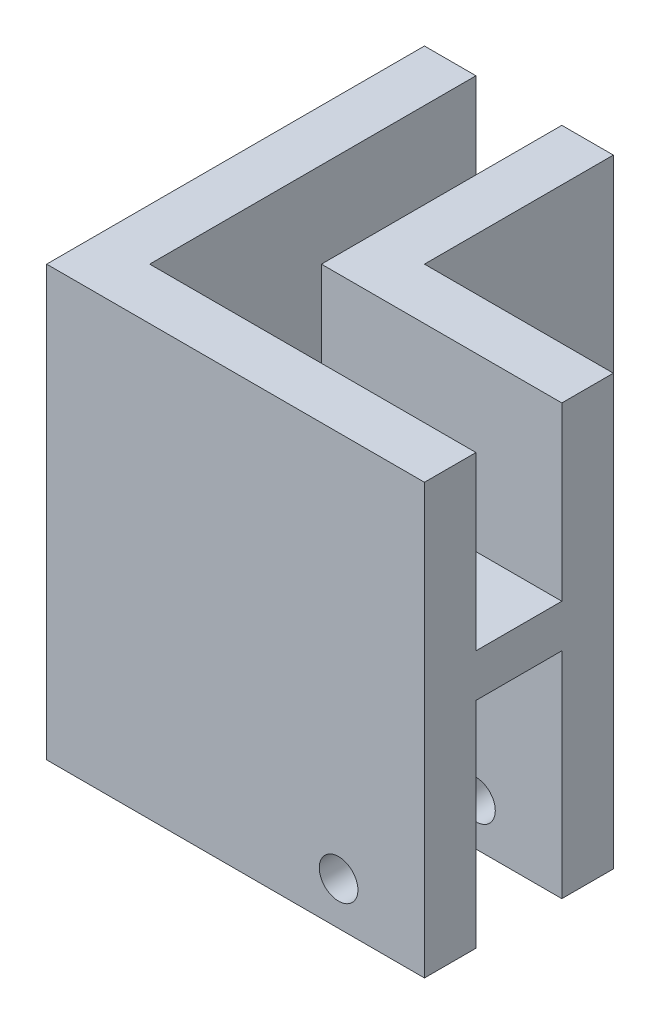
ISO-10303-21;
HEADER;
FILE_DESCRIPTION(('STEP AP214'),'2;1');
FILE_NAME('part.step','',(''),(''),'','','');
FILE_SCHEMA(('AUTOMOTIVE_DESIGN { 1 0 10303 214 1 1 1 1 }'));
ENDSEC;
DATA;
#1=APPLICATION_CONTEXT('core data for automotive mechanical design processes');
#2=APPLICATION_PROTOCOL_DEFINITION('international standard','automotive_design',2000,#1);
#3=PRODUCT_CONTEXT('',#1,'mechanical');
#4=PRODUCT('Part','Part','',(#3));
#5=PRODUCT_RELATED_PRODUCT_CATEGORY('part','',(#4));
#6=PRODUCT_DEFINITION_FORMATION('','',#4);
#7=PRODUCT_DEFINITION_CONTEXT('part definition',#1,'design');
#8=PRODUCT_DEFINITION('design','',#6,#7);
#9=PRODUCT_DEFINITION_SHAPE('','',#8);
#10=(LENGTH_UNIT() NAMED_UNIT(*) SI_UNIT(.MILLI.,.METRE.));
#11=(NAMED_UNIT(*) PLANE_ANGLE_UNIT() SI_UNIT($,.RADIAN.));
#12=(NAMED_UNIT(*) SI_UNIT($,.STERADIAN.) SOLID_ANGLE_UNIT());
#13=UNCERTAINTY_MEASURE_WITH_UNIT(LENGTH_MEASURE(1.E-05),#10,'distance_accuracy_value','');
#14=(GEOMETRIC_REPRESENTATION_CONTEXT(3) GLOBAL_UNCERTAINTY_ASSIGNED_CONTEXT((#13)) GLOBAL_UNIT_ASSIGNED_CONTEXT((#10,
#11,#12)) REPRESENTATION_CONTEXT('',''));
#15=CARTESIAN_POINT('',(0.,0.,0.));
#16=DIRECTION('',(0.,0.,1.));
#17=DIRECTION('',(1.,0.,0.));
#18=AXIS2_PLACEMENT_3D('',#15,#16,#17);
#19=CARTESIAN_POINT('',(6.,25.,28.));
#20=DIRECTION('',(-1.,0.,0.));
#21=DIRECTION('',(0.,-1.,0.));
#22=AXIS2_PLACEMENT_3D('',#19,#20,#21);
#23=PLANE('',#22);
#24=CARTESIAN_POINT('',(6.00000000000001,-20.,10.));
#25=DIRECTION('',(-1.,0.,0.));
#26=DIRECTION('',(0.,-1.,0.));
#27=AXIS2_PLACEMENT_3D('',#24,#25,#26);
#28=CIRCLE('',#27,2.24999999999999);
#29=CARTESIAN_POINT('',(6.00000000000001,-22.25,10.));
#30=VERTEX_POINT('',#29);
#31=EDGE_CURVE('E376',#30,#30,#28,.T.);
#32=ORIENTED_EDGE('',*,*,#31,.T.);
#33=EDGE_LOOP('',(#32));
#34=FACE_BOUND('',#33,.T.);
#35=DIRECTION('',(0.,1.,0.));
#36=VECTOR('',#35,1.);
#37=CARTESIAN_POINT('',(6.,25.,22.));
#38=LINE('',#37,#36);
#39=CARTESIAN_POINT('',(6.,-25.,22.));
#40=VERTEX_POINT('',#39);
#41=CARTESIAN_POINT('',(6.,25.,22.));
#42=VERTEX_POINT('',#41);
#43=EDGE_CURVE('E54',#40,#42,#38,.T.);
#44=ORIENTED_EDGE('',*,*,#43,.F.);
#45=DIRECTION('',(0.,0.,-1.));
#46=VECTOR('',#45,1.);
#47=CARTESIAN_POINT('',(6.,-25.,28.));
#48=LINE('',#47,#46);
#49=CARTESIAN_POINT('',(6.,-25.,0.));
#50=VERTEX_POINT('',#49);
#51=EDGE_CURVE('E184',#40,#50,#48,.T.);
#52=ORIENTED_EDGE('',*,*,#51,.T.);
#53=DIRECTION('',(0.,1.,0.));
#54=VECTOR('',#53,1.);
#55=CARTESIAN_POINT('',(6.,25.,0.));
#56=LINE('',#55,#54);
#57=CARTESIAN_POINT('',(6.,25.,0.));
#58=VERTEX_POINT('',#57);
#59=EDGE_CURVE('E136',#50,#58,#56,.T.);
#60=ORIENTED_EDGE('',*,*,#59,.T.);
#61=DIRECTION('',(0.,0.,-1.));
#62=VECTOR('',#61,1.);
#63=CARTESIAN_POINT('',(6.,25.,28.));
#64=LINE('',#63,#62);
#65=EDGE_CURVE('E183',#42,#58,#64,.T.);
#66=ORIENTED_EDGE('',*,*,#65,.F.);
#67=EDGE_LOOP('',(#44,#52,#60,#66));
#68=FACE_BOUND('',#67,.T.);
#69=ADVANCED_FACE('F37',(#34,#68),#23,.F.);
#70=CARTESIAN_POINT('',(0.,0.,28.));
#71=DIRECTION('',(0.,0.,1.));
#72=DIRECTION('',(1.,0.,0.));
#73=AXIS2_PLACEMENT_3D('',#70,#71,#72);
#74=PLANE('',#73);
#75=DIRECTION('',(0.,-1.,0.));
#76=VECTOR('',#75,1.);
#77=CARTESIAN_POINT('',(0.,5.,28.));
#78=LINE('',#77,#76);
#79=CARTESIAN_POINT('',(0.,25.,28.));
#80=VERTEX_POINT('',#79);
#81=CARTESIAN_POINT('',(0.,5.,28.));
#82=VERTEX_POINT('',#81);
#83=EDGE_CURVE('E127',#80,#82,#78,.T.);
#84=ORIENTED_EDGE('',*,*,#83,.T.);
#85=DIRECTION('',(1.,0.,0.));
#86=VECTOR('',#85,1.);
#87=CARTESIAN_POINT('',(-10.,5.,28.));
#88=LINE('',#87,#86);
#89=CARTESIAN_POINT('',(28.,5.00000000000001,28.));
#90=VERTEX_POINT('',#89);
#91=EDGE_CURVE('E46',#82,#90,#88,.T.);
#92=ORIENTED_EDGE('',*,*,#91,.T.);
#93=DIRECTION('',(0.,-1.,0.));
#94=VECTOR('',#93,1.);
#95=CARTESIAN_POINT('',(28.,5.00000000000001,28.));
#96=LINE('',#95,#94);
#97=CARTESIAN_POINT('',(28.,25.,28.));
#98=VERTEX_POINT('',#97);
#99=EDGE_CURVE('E348',#98,#90,#96,.T.);
#100=ORIENTED_EDGE('',*,*,#99,.F.);
#101=DIRECTION('',(-1.,0.,0.));
#102=VECTOR('',#101,1.);
#103=CARTESIAN_POINT('',(0.,25.,28.));
#104=LINE('',#103,#102);
#105=EDGE_CURVE('E63',#98,#80,#104,.T.);
#106=ORIENTED_EDGE('',*,*,#105,.T.);
#107=EDGE_LOOP('',(#84,#92,#100,#106));
#108=FACE_BOUND('',#107,.T.);
#109=ADVANCED_FACE('F200',(#108),#74,.T.);
#110=CARTESIAN_POINT('',(0.,-25.,28.));
#111=DIRECTION('',(1.,0.,0.));
#112=DIRECTION('',(0.,0.,-1.));
#113=AXIS2_PLACEMENT_3D('',#110,#111,#112);
#114=PLANE('',#113);
#115=CARTESIAN_POINT('',(0.,-20.,10.));
#116=DIRECTION('',(1.,0.,0.));
#117=DIRECTION('',(0.,0.,-1.));
#118=AXIS2_PLACEMENT_3D('',#115,#116,#117);
#119=CIRCLE('',#118,2.24999999999999);
#120=CARTESIAN_POINT('',(0.,-20.,7.75000000000001));
#121=VERTEX_POINT('',#120);
#122=EDGE_CURVE('E374',#121,#121,#119,.T.);
#123=ORIENTED_EDGE('',*,*,#122,.T.);
#124=EDGE_LOOP('',(#123));
#125=FACE_BOUND('',#124,.T.);
#126=DIRECTION('',(0.,-1.,0.));
#127=VECTOR('',#126,1.);
#128=CARTESIAN_POINT('',(0.,-25.,0.));
#129=LINE('',#128,#127);
#130=CARTESIAN_POINT('',(0.,0.,0.));
#131=VERTEX_POINT('',#130);
#132=CARTESIAN_POINT('',(0.,-25.,0.));
#133=VERTEX_POINT('',#132);
#134=EDGE_CURVE('E125',#131,#133,#129,.T.);
#135=ORIENTED_EDGE('',*,*,#134,.T.);
#136=DIRECTION('',(0.,0.,-1.));
#137=VECTOR('',#136,1.);
#138=CARTESIAN_POINT('',(0.,-25.,28.));
#139=LINE('',#138,#137);
#140=CARTESIAN_POINT('',(0.,-25.,28.));
#141=VERTEX_POINT('',#140);
#142=EDGE_CURVE('E41',#141,#133,#139,.T.);
#143=ORIENTED_EDGE('',*,*,#142,.F.);
#144=DIRECTION('',(0.,-1.,0.));
#145=VECTOR('',#144,1.);
#146=CARTESIAN_POINT('',(0.,-25.,28.));
#147=LINE('',#146,#145);
#148=CARTESIAN_POINT('',(0.,0.,28.));
#149=VERTEX_POINT('',#148);
#150=EDGE_CURVE('E119',#149,#141,#147,.T.);
#151=ORIENTED_EDGE('',*,*,#150,.F.);
#152=DIRECTION('',(0.,0.,-1.));
#153=VECTOR('',#152,1.);
#154=CARTESIAN_POINT('',(0.,0.,28.));
#155=LINE('',#154,#153);
#156=EDGE_CURVE('E111',#149,#131,#155,.T.);
#157=ORIENTED_EDGE('',*,*,#156,.T.);
#158=EDGE_LOOP('',(#135,#143,#151,#157));
#159=FACE_BOUND('',#158,.T.);
#160=ADVANCED_FACE('F39',(#125,#159),#114,.F.);
#161=CARTESIAN_POINT('',(6.,-25.,28.));
#162=DIRECTION('',(0.,1.,0.));
#163=DIRECTION('',(0.,0.,1.));
#164=AXIS2_PLACEMENT_3D('',#161,#162,#163);
#165=PLANE('',#164);
#166=DIRECTION('',(1.,0.,0.));
#167=VECTOR('',#166,1.);
#168=CARTESIAN_POINT('',(6.,-25.,0.));
#169=LINE('',#168,#167);
#170=EDGE_CURVE('E132',#133,#50,#169,.T.);
#171=ORIENTED_EDGE('',*,*,#170,.T.);
#172=ORIENTED_EDGE('',*,*,#51,.F.);
#173=DIRECTION('',(-1.,0.,0.));
#174=VECTOR('',#173,1.);
#175=CARTESIAN_POINT('',(28.,-25.,22.));
#176=LINE('',#175,#174);
#177=CARTESIAN_POINT('',(28.,-25.,22.));
#178=VERTEX_POINT('',#177);
#179=EDGE_CURVE('E248',#178,#40,#176,.T.);
#180=ORIENTED_EDGE('',*,*,#179,.F.);
#181=DIRECTION('',(0.,0.,-1.));
#182=VECTOR('',#181,1.);
#183=CARTESIAN_POINT('',(28.,-25.,22.));
#184=LINE('',#183,#182);
#185=CARTESIAN_POINT('',(28.,-25.,28.));
#186=VERTEX_POINT('',#185);
#187=EDGE_CURVE('E300',#186,#178,#184,.T.);
#188=ORIENTED_EDGE('',*,*,#187,.F.);
#189=DIRECTION('',(1.,0.,0.));
#190=VECTOR('',#189,1.);
#191=CARTESIAN_POINT('',(6.,-25.,28.));
#192=LINE('',#191,#190);
#193=EDGE_CURVE('E196',#141,#186,#192,.T.);
#194=ORIENTED_EDGE('',*,*,#193,.F.);
#195=ORIENTED_EDGE('',*,*,#142,.T.);
#196=EDGE_LOOP('',(#171,#172,#180,#188,#194,#195));
#197=FACE_BOUND('',#196,.T.);
#198=ADVANCED_FACE('F297',(#197),#165,.F.);
#199=CARTESIAN_POINT('',(0.,25.,28.));
#200=DIRECTION('',(0.,-1.,0.));
#201=DIRECTION('',(0.,0.,-1.));
#202=AXIS2_PLACEMENT_3D('',#199,#200,#201);
#203=PLANE('',#202);
#204=DIRECTION('',(-1.,0.,0.));
#205=VECTOR('',#204,1.);
#206=CARTESIAN_POINT('',(0.,25.,0.));
#207=LINE('',#206,#205);
#208=CARTESIAN_POINT('',(0.,25.,0.));
#209=VERTEX_POINT('',#208);
#210=EDGE_CURVE('E146',#58,#209,#207,.T.);
#211=ORIENTED_EDGE('',*,*,#210,.T.);
#212=DIRECTION('',(0.,0.,-1.));
#213=VECTOR('',#212,1.);
#214=CARTESIAN_POINT('',(0.,25.,28.));
#215=LINE('',#214,#213);
#216=EDGE_CURVE('E180',#80,#209,#215,.T.);
#217=ORIENTED_EDGE('',*,*,#216,.F.);
#218=ORIENTED_EDGE('',*,*,#105,.F.);
#219=DIRECTION('',(0.,0.,1.));
#220=VECTOR('',#219,1.);
#221=CARTESIAN_POINT('',(28.,25.,28.));
#222=LINE('',#221,#220);
#223=CARTESIAN_POINT('',(28.,25.,22.));
#224=VERTEX_POINT('',#223);
#225=EDGE_CURVE('E345',#224,#98,#222,.T.);
#226=ORIENTED_EDGE('',*,*,#225,.F.);
#227=DIRECTION('',(-1.,0.,0.));
#228=VECTOR('',#227,1.);
#229=CARTESIAN_POINT('',(28.,25.,22.));
#230=LINE('',#229,#228);
#231=EDGE_CURVE('E278',#224,#42,#230,.T.);
#232=ORIENTED_EDGE('',*,*,#231,.T.);
#233=ORIENTED_EDGE('',*,*,#65,.T.);
#234=EDGE_LOOP('',(#211,#217,#218,#226,#232,#233));
#235=FACE_BOUND('',#234,.T.);
#236=ADVANCED_FACE('F353',(#235),#203,.F.);
#237=CARTESIAN_POINT('',(0.,5.,28.));
#238=DIRECTION('',(1.,0.,0.));
#239=DIRECTION('',(0.,1.,0.));
#240=AXIS2_PLACEMENT_3D('',#237,#238,#239);
#241=PLANE('',#240);
#242=DIRECTION('',(0.,-1.,0.));
#243=VECTOR('',#242,1.);
#244=CARTESIAN_POINT('',(0.,5.,0.));
#245=LINE('',#244,#243);
#246=CARTESIAN_POINT('',(0.,5.,0.));
#247=VERTEX_POINT('',#246);
#248=EDGE_CURVE('E148',#209,#247,#245,.T.);
#249=ORIENTED_EDGE('',*,*,#248,.T.);
#250=DIRECTION('',(0.,0.,-1.));
#251=VECTOR('',#250,1.);
#252=CARTESIAN_POINT('',(0.,5.,28.));
#253=LINE('',#252,#251);
#254=EDGE_CURVE('E177',#82,#247,#253,.T.);
#255=ORIENTED_EDGE('',*,*,#254,.F.);
#256=ORIENTED_EDGE('',*,*,#83,.F.);
#257=ORIENTED_EDGE('',*,*,#216,.T.);
#258=EDGE_LOOP('',(#249,#255,#256,#257));
#259=FACE_BOUND('',#258,.T.);
#260=ADVANCED_FACE('F202',(#259),#241,.F.);
#261=CARTESIAN_POINT('',(-10.,5.,28.));
#262=DIRECTION('',(0.,-1.,0.));
#263=DIRECTION('',(0.,0.,-1.));
#264=AXIS2_PLACEMENT_3D('',#261,#262,#263);
#265=PLANE('',#264);
#266=DIRECTION('',(-1.,0.,0.));
#267=VECTOR('',#266,1.);
#268=CARTESIAN_POINT('',(-10.,5.,0.));
#269=LINE('',#268,#267);
#270=CARTESIAN_POINT('',(-10.,5.,0.));
#271=VERTEX_POINT('',#270);
#272=EDGE_CURVE('E150',#247,#271,#269,.T.);
#273=ORIENTED_EDGE('',*,*,#272,.T.);
#274=DIRECTION('',(0.,0.,-1.));
#275=VECTOR('',#274,1.);
#276=CARTESIAN_POINT('',(-10.,5.,28.));
#277=LINE('',#276,#275);
#278=CARTESIAN_POINT('',(-10.,5.,38.));
#279=VERTEX_POINT('',#278);
#280=EDGE_CURVE('E174',#279,#271,#277,.T.);
#281=ORIENTED_EDGE('',*,*,#280,.F.);
#282=DIRECTION('',(1.,0.,0.));
#283=VECTOR('',#282,1.);
#284=CARTESIAN_POINT('',(-10.,5.,38.));
#285=LINE('',#284,#283);
#286=CARTESIAN_POINT('',(28.,5.,38.));
#287=VERTEX_POINT('',#286);
#288=EDGE_CURVE('E193',#279,#287,#285,.T.);
#289=ORIENTED_EDGE('',*,*,#288,.T.);
#290=DIRECTION('',(0.,0.,1.));
#291=VECTOR('',#290,1.);
#292=CARTESIAN_POINT('',(28.,5.,38.));
#293=LINE('',#292,#291);
#294=EDGE_CURVE('E350',#90,#287,#293,.T.);
#295=ORIENTED_EDGE('',*,*,#294,.F.);
#296=ORIENTED_EDGE('',*,*,#91,.F.);
#297=ORIENTED_EDGE('',*,*,#254,.T.);
#298=EDGE_LOOP('',(#273,#281,#289,#295,#296,#297));
#299=FACE_BOUND('',#298,.T.);
#300=ADVANCED_FACE('F206',(#299),#265,.F.);
#301=CARTESIAN_POINT('',(-10.,25.,28.));
#302=DIRECTION('',(-1.,0.,0.));
#303=DIRECTION('',(0.,-1.,0.));
#304=AXIS2_PLACEMENT_3D('',#301,#302,#303);
#305=PLANE('',#304);
#306=DIRECTION('',(0.,1.,0.));
#307=VECTOR('',#306,1.);
#308=CARTESIAN_POINT('',(-10.,25.,0.));
#309=LINE('',#308,#307);
#310=CARTESIAN_POINT('',(-10.,25.,0.));
#311=VERTEX_POINT('',#310);
#312=EDGE_CURVE('E152',#271,#311,#309,.T.);
#313=ORIENTED_EDGE('',*,*,#312,.T.);
#314=DIRECTION('',(0.,0.,-1.));
#315=VECTOR('',#314,1.);
#316=CARTESIAN_POINT('',(-10.,25.,28.));
#317=LINE('',#316,#315);
#318=CARTESIAN_POINT('',(-10.,25.,38.));
#319=VERTEX_POINT('',#318);
#320=EDGE_CURVE('E171',#319,#311,#317,.T.);
#321=ORIENTED_EDGE('',*,*,#320,.F.);
#322=DIRECTION('',(0.,1.,0.));
#323=VECTOR('',#322,1.);
#324=CARTESIAN_POINT('',(-10.,25.,38.));
#325=LINE('',#324,#323);
#326=EDGE_CURVE('E238',#279,#319,#325,.T.);
#327=ORIENTED_EDGE('',*,*,#326,.F.);
#328=ORIENTED_EDGE('',*,*,#280,.T.);
#329=EDGE_LOOP('',(#313,#321,#327,#328));
#330=FACE_BOUND('',#329,.T.);
#331=ADVANCED_FACE('F215',(#330),#305,.F.);
#332=CARTESIAN_POINT('',(-16.,25.,28.));
#333=DIRECTION('',(0.,-1.,0.));
#334=DIRECTION('',(0.,0.,-1.));
#335=AXIS2_PLACEMENT_3D('',#332,#333,#334);
#336=PLANE('',#335);
#337=DIRECTION('',(-1.,0.,0.));
#338=VECTOR('',#337,1.);
#339=CARTESIAN_POINT('',(-16.,25.,0.));
#340=LINE('',#339,#338);
#341=CARTESIAN_POINT('',(-16.,25.,0.));
#342=VERTEX_POINT('',#341);
#343=EDGE_CURVE('E154',#311,#342,#340,.T.);
#344=ORIENTED_EDGE('',*,*,#343,.T.);
#345=DIRECTION('',(0.,0.,-1.));
#346=VECTOR('',#345,1.);
#347=CARTESIAN_POINT('',(-16.,25.,28.));
#348=LINE('',#347,#346);
#349=CARTESIAN_POINT('',(-16.,25.,44.));
#350=VERTEX_POINT('',#349);
#351=EDGE_CURVE('E168',#350,#342,#348,.T.);
#352=ORIENTED_EDGE('',*,*,#351,.F.);
#353=DIRECTION('',(1.,0.,0.));
#354=VECTOR('',#353,1.);
#355=CARTESIAN_POINT('',(-10.,25.,44.));
#356=LINE('',#355,#354);
#357=CARTESIAN_POINT('',(28.,25.,44.));
#358=VERTEX_POINT('',#357);
#359=EDGE_CURVE('E236',#350,#358,#356,.T.);
#360=ORIENTED_EDGE('',*,*,#359,.T.);
#361=DIRECTION('',(0.,0.,1.));
#362=VECTOR('',#361,1.);
#363=CARTESIAN_POINT('',(28.,25.,44.));
#364=LINE('',#363,#362);
#365=CARTESIAN_POINT('',(28.,25.,38.));
#366=VERTEX_POINT('',#365);
#367=EDGE_CURVE('E229',#366,#358,#364,.T.);
#368=ORIENTED_EDGE('',*,*,#367,.F.);
#369=DIRECTION('',(1.,0.,0.));
#370=VECTOR('',#369,1.);
#371=CARTESIAN_POINT('',(-10.,25.,38.));
#372=LINE('',#371,#370);
#373=EDGE_CURVE('E224',#319,#366,#372,.T.);
#374=ORIENTED_EDGE('',*,*,#373,.F.);
#375=ORIENTED_EDGE('',*,*,#320,.T.);
#376=EDGE_LOOP('',(#344,#352,#360,#368,#374,#375));
#377=FACE_BOUND('',#376,.T.);
#378=ADVANCED_FACE('F220',(#377),#336,.F.);
#379=CARTESIAN_POINT('',(-16.,-25.,28.));
#380=DIRECTION('',(1.,0.,0.));
#381=DIRECTION('',(0.,1.,0.));
#382=AXIS2_PLACEMENT_3D('',#379,#380,#381);
#383=PLANE('',#382);
#384=CARTESIAN_POINT('',(-16.,-20.,10.));
#385=DIRECTION('',(-1.,0.,0.));
#386=DIRECTION('',(0.,0.,1.));
#387=AXIS2_PLACEMENT_3D('',#384,#385,#386);
#388=CIRCLE('',#387,2.24999999999999);
#389=CARTESIAN_POINT('',(-16.,-20.,12.25));
#390=VERTEX_POINT('',#389);
#391=EDGE_CURVE('E382',#390,#390,#388,.T.);
#392=ORIENTED_EDGE('',*,*,#391,.F.);
#393=EDGE_LOOP('',(#392));
#394=FACE_BOUND('',#393,.T.);
#395=DIRECTION('',(0.,-1.,0.));
#396=VECTOR('',#395,1.);
#397=CARTESIAN_POINT('',(-16.,-25.,0.));
#398=LINE('',#397,#396);
#399=CARTESIAN_POINT('',(-16.,-25.,0.));
#400=VERTEX_POINT('',#399);
#401=EDGE_CURVE('E156',#342,#400,#398,.T.);
#402=ORIENTED_EDGE('',*,*,#401,.T.);
#403=DIRECTION('',(0.,0.,-1.));
#404=VECTOR('',#403,1.);
#405=CARTESIAN_POINT('',(-16.,-25.,28.));
#406=LINE('',#405,#404);
#407=CARTESIAN_POINT('',(-16.,-25.,44.));
#408=VERTEX_POINT('',#407);
#409=EDGE_CURVE('E165',#408,#400,#406,.T.);
#410=ORIENTED_EDGE('',*,*,#409,.F.);
#411=DIRECTION('',(0.,1.,0.));
#412=VECTOR('',#411,1.);
#413=CARTESIAN_POINT('',(-16.,25.,44.));
#414=LINE('',#413,#412);
#415=EDGE_CURVE('E243',#408,#350,#414,.T.);
#416=ORIENTED_EDGE('',*,*,#415,.T.);
#417=ORIENTED_EDGE('',*,*,#351,.T.);
#418=EDGE_LOOP('',(#402,#410,#416,#417));
#419=FACE_BOUND('',#418,.T.);
#420=ADVANCED_FACE('F417',(#394,#419),#383,.F.);
#421=CARTESIAN_POINT('',(-9.99999999999999,-25.,28.));
#422=DIRECTION('',(0.,1.,0.));
#423=DIRECTION('',(-1.,0.,0.));
#424=AXIS2_PLACEMENT_3D('',#421,#422,#423);
#425=PLANE('',#424);
#426=DIRECTION('',(1.,0.,0.));
#427=VECTOR('',#426,1.);
#428=CARTESIAN_POINT('',(-9.99999999999999,-25.,0.));
#429=LINE('',#428,#427);
#430=CARTESIAN_POINT('',(-9.99999999999999,-25.,0.));
#431=VERTEX_POINT('',#430);
#432=EDGE_CURVE('E158',#400,#431,#429,.T.);
#433=ORIENTED_EDGE('',*,*,#432,.T.);
#434=DIRECTION('',(0.,0.,-1.));
#435=VECTOR('',#434,1.);
#436=CARTESIAN_POINT('',(-9.99999999999999,-25.,28.));
#437=LINE('',#436,#435);
#438=CARTESIAN_POINT('',(-9.99999999999999,-25.,38.));
#439=VERTEX_POINT('',#438);
#440=EDGE_CURVE('E162',#439,#431,#437,.T.);
#441=ORIENTED_EDGE('',*,*,#440,.F.);
#442=DIRECTION('',(1.,0.,0.));
#443=VECTOR('',#442,1.);
#444=CARTESIAN_POINT('',(-10.,-25.,38.));
#445=LINE('',#444,#443);
#446=CARTESIAN_POINT('',(28.,-25.,38.));
#447=VERTEX_POINT('',#446);
#448=EDGE_CURVE('E139',#439,#447,#445,.T.);
#449=ORIENTED_EDGE('',*,*,#448,.T.);
#450=DIRECTION('',(0.,0.,-1.));
#451=VECTOR('',#450,1.);
#452=CARTESIAN_POINT('',(28.,-25.,38.));
#453=LINE('',#452,#451);
#454=CARTESIAN_POINT('',(28.,-25.,44.));
#455=VERTEX_POINT('',#454);
#456=EDGE_CURVE('E276',#455,#447,#453,.T.);
#457=ORIENTED_EDGE('',*,*,#456,.F.);
#458=DIRECTION('',(1.,0.,0.));
#459=VECTOR('',#458,1.);
#460=CARTESIAN_POINT('',(-10.,-25.,44.));
#461=LINE('',#460,#459);
#462=EDGE_CURVE('E254',#408,#455,#461,.T.);
#463=ORIENTED_EDGE('',*,*,#462,.F.);
#464=ORIENTED_EDGE('',*,*,#409,.T.);
#465=EDGE_LOOP('',(#433,#441,#449,#457,#463,#464));
#466=FACE_BOUND('',#465,.T.);
#467=ADVANCED_FACE('F413',(#466),#425,.F.);
#468=CARTESIAN_POINT('',(-10.,0.,28.));
#469=DIRECTION('',(-1.,0.,0.));
#470=DIRECTION('',(0.,-1.,0.));
#471=AXIS2_PLACEMENT_3D('',#468,#469,#470);
#472=PLANE('',#471);
#473=CARTESIAN_POINT('',(-9.99999999999999,-20.,10.));
#474=DIRECTION('',(-1.,0.,0.));
#475=DIRECTION('',(0.,-1.,0.));
#476=AXIS2_PLACEMENT_3D('',#473,#474,#475);
#477=CIRCLE('',#476,2.24999999999999);
#478=CARTESIAN_POINT('',(-9.99999999999999,-22.25,10.));
#479=VERTEX_POINT('',#478);
#480=EDGE_CURVE('E377',#479,#479,#477,.T.);
#481=ORIENTED_EDGE('',*,*,#480,.T.);
#482=EDGE_LOOP('',(#481));
#483=FACE_BOUND('',#482,.T.);
#484=DIRECTION('',(0.,1.,0.));
#485=VECTOR('',#484,1.);
#486=CARTESIAN_POINT('',(-10.,0.,0.));
#487=LINE('',#486,#485);
#488=CARTESIAN_POINT('',(-10.,0.,0.));
#489=VERTEX_POINT('',#488);
#490=EDGE_CURVE('E120',#431,#489,#487,.T.);
#491=ORIENTED_EDGE('',*,*,#490,.T.);
#492=DIRECTION('',(0.,0.,-1.));
#493=VECTOR('',#492,1.);
#494=CARTESIAN_POINT('',(-10.,0.,28.));
#495=LINE('',#494,#493);
#496=CARTESIAN_POINT('',(-10.,0.,38.));
#497=VERTEX_POINT('',#496);
#498=EDGE_CURVE('E115',#497,#489,#495,.T.);
#499=ORIENTED_EDGE('',*,*,#498,.F.);
#500=DIRECTION('',(0.,1.,0.));
#501=VECTOR('',#500,1.);
#502=CARTESIAN_POINT('',(-10.,0.,38.));
#503=LINE('',#502,#501);
#504=EDGE_CURVE('E242',#439,#497,#503,.T.);
#505=ORIENTED_EDGE('',*,*,#504,.F.);
#506=ORIENTED_EDGE('',*,*,#440,.T.);
#507=EDGE_LOOP('',(#491,#499,#505,#506));
#508=FACE_BOUND('',#507,.T.);
#509=ADVANCED_FACE('F406',(#483,#508),#472,.F.);
#510=CARTESIAN_POINT('',(0.,0.,28.));
#511=DIRECTION('',(0.,1.,0.));
#512=DIRECTION('',(0.,0.,1.));
#513=AXIS2_PLACEMENT_3D('',#510,#511,#512);
#514=PLANE('',#513);
#515=DIRECTION('',(1.,0.,0.));
#516=VECTOR('',#515,1.);
#517=CARTESIAN_POINT('',(0.,0.,0.));
#518=LINE('',#517,#516);
#519=EDGE_CURVE('E107',#489,#131,#518,.T.);
#520=ORIENTED_EDGE('',*,*,#519,.T.);
#521=ORIENTED_EDGE('',*,*,#156,.F.);
#522=DIRECTION('',(1.,0.,0.));
#523=VECTOR('',#522,1.);
#524=CARTESIAN_POINT('',(-10.,0.,28.));
#525=LINE('',#524,#523);
#526=CARTESIAN_POINT('',(28.,0.,28.));
#527=VERTEX_POINT('',#526);
#528=EDGE_CURVE('E11',#149,#527,#525,.T.);
#529=ORIENTED_EDGE('',*,*,#528,.T.);
#530=DIRECTION('',(0.,0.,-1.));
#531=VECTOR('',#530,1.);
#532=CARTESIAN_POINT('',(28.,0.,28.));
#533=LINE('',#532,#531);
#534=CARTESIAN_POINT('',(28.,0.,38.));
#535=VERTEX_POINT('',#534);
#536=EDGE_CURVE('E336',#535,#527,#533,.T.);
#537=ORIENTED_EDGE('',*,*,#536,.F.);
#538=DIRECTION('',(1.,0.,0.));
#539=VECTOR('',#538,1.);
#540=CARTESIAN_POINT('',(-10.,0.,38.));
#541=LINE('',#540,#539);
#542=EDGE_CURVE('E134',#497,#535,#541,.T.);
#543=ORIENTED_EDGE('',*,*,#542,.F.);
#544=ORIENTED_EDGE('',*,*,#498,.T.);
#545=EDGE_LOOP('',(#520,#521,#529,#537,#543,#544));
#546=FACE_BOUND('',#545,.T.);
#547=ADVANCED_FACE('F109',(#546),#514,.F.);
#548=CARTESIAN_POINT('',(18.,-20.,28.));
#549=DIRECTION('',(0.,0.,1.));
#550=DIRECTION('',(1.,0.,0.));
#551=AXIS2_PLACEMENT_3D('',#548,#549,#550);
#552=CIRCLE('',#551,2.24999999999999);
#553=CARTESIAN_POINT('',(20.25,-20.,28.));
#554=VERTEX_POINT('',#553);
#555=EDGE_CURVE('E284',#554,#554,#552,.T.);
#556=ORIENTED_EDGE('',*,*,#555,.F.);
#557=EDGE_LOOP('',(#556));
#558=FACE_BOUND('',#557,.T.);
#559=ORIENTED_EDGE('',*,*,#528,.F.);
#560=ORIENTED_EDGE('',*,*,#150,.T.);
#561=ORIENTED_EDGE('',*,*,#193,.T.);
#562=DIRECTION('',(0.,-1.,0.));
#563=VECTOR('',#562,1.);
#564=CARTESIAN_POINT('',(28.,-25.,28.));
#565=LINE('',#564,#563);
#566=EDGE_CURVE('E333',#527,#186,#565,.T.);
#567=ORIENTED_EDGE('',*,*,#566,.F.);
#568=EDGE_LOOP('',(#559,#560,#561,#567));
#569=FACE_BOUND('',#568,.T.);
#570=ADVANCED_FACE('F332',(#558,#569),#74,.T.);
#571=CARTESIAN_POINT('',(0.,0.,0.));
#572=DIRECTION('',(0.,0.,1.));
#573=DIRECTION('',(1.,0.,0.));
#574=AXIS2_PLACEMENT_3D('',#571,#572,#573);
#575=PLANE('',#574);
#576=ORIENTED_EDGE('',*,*,#134,.F.);
#577=ORIENTED_EDGE('',*,*,#519,.F.);
#578=ORIENTED_EDGE('',*,*,#490,.F.);
#579=ORIENTED_EDGE('',*,*,#432,.F.);
#580=ORIENTED_EDGE('',*,*,#401,.F.);
#581=ORIENTED_EDGE('',*,*,#343,.F.);
#582=ORIENTED_EDGE('',*,*,#312,.F.);
#583=ORIENTED_EDGE('',*,*,#272,.F.);
#584=ORIENTED_EDGE('',*,*,#248,.F.);
#585=ORIENTED_EDGE('',*,*,#210,.F.);
#586=ORIENTED_EDGE('',*,*,#59,.F.);
#587=ORIENTED_EDGE('',*,*,#170,.F.);
#588=EDGE_LOOP('',(#576,#577,#578,#579,#580,#581,#582,#583,#584,#585,#586,#587));
#589=FACE_BOUND('',#588,.T.);
#590=ADVANCED_FACE('F129',(#589),#575,.F.);
#591=CARTESIAN_POINT('',(-10.,0.,38.));
#592=DIRECTION('',(0.,0.,-1.));
#593=DIRECTION('',(-1.,0.,0.));
#594=AXIS2_PLACEMENT_3D('',#591,#592,#593);
#595=PLANE('',#594);
#596=CARTESIAN_POINT('',(18.,-20.,38.));
#597=DIRECTION('',(0.,0.,-1.));
#598=DIRECTION('',(-1.,0.,0.));
#599=AXIS2_PLACEMENT_3D('',#596,#597,#598);
#600=CIRCLE('',#599,2.24999999999999);
#601=CARTESIAN_POINT('',(15.75,-20.,38.));
#602=VERTEX_POINT('',#601);
#603=EDGE_CURVE('E391',#602,#602,#600,.T.);
#604=ORIENTED_EDGE('',*,*,#603,.F.);
#605=EDGE_LOOP('',(#604));
#606=FACE_BOUND('',#605,.T.);
#607=ORIENTED_EDGE('',*,*,#542,.T.);
#608=DIRECTION('',(0.,1.,0.));
#609=VECTOR('',#608,1.);
#610=CARTESIAN_POINT('',(28.,0.,38.));
#611=LINE('',#610,#609);
#612=EDGE_CURVE('E283',#447,#535,#611,.T.);
#613=ORIENTED_EDGE('',*,*,#612,.F.);
#614=ORIENTED_EDGE('',*,*,#448,.F.);
#615=ORIENTED_EDGE('',*,*,#504,.T.);
#616=EDGE_LOOP('',(#607,#613,#614,#615));
#617=FACE_BOUND('',#616,.T.);
#618=ADVANCED_FACE('F404',(#606,#617),#595,.T.);
#619=CARTESIAN_POINT('',(-10.,-25.,44.));
#620=DIRECTION('',(0.,0.,1.));
#621=DIRECTION('',(0.,-1.,0.));
#622=AXIS2_PLACEMENT_3D('',#619,#620,#621);
#623=PLANE('',#622);
#624=CARTESIAN_POINT('',(18.,-20.,44.));
#625=DIRECTION('',(0.,0.,1.));
#626=DIRECTION('',(1.,0.,0.));
#627=AXIS2_PLACEMENT_3D('',#624,#625,#626);
#628=CIRCLE('',#627,2.24999999999999);
#629=CARTESIAN_POINT('',(20.25,-20.,44.));
#630=VERTEX_POINT('',#629);
#631=EDGE_CURVE('E379',#630,#630,#628,.T.);
#632=ORIENTED_EDGE('',*,*,#631,.F.);
#633=EDGE_LOOP('',(#632));
#634=FACE_BOUND('',#633,.T.);
#635=ORIENTED_EDGE('',*,*,#462,.T.);
#636=DIRECTION('',(0.,-1.,0.));
#637=VECTOR('',#636,1.);
#638=CARTESIAN_POINT('',(28.,-25.,44.));
#639=LINE('',#638,#637);
#640=EDGE_CURVE('E269',#358,#455,#639,.T.);
#641=ORIENTED_EDGE('',*,*,#640,.F.);
#642=ORIENTED_EDGE('',*,*,#359,.F.);
#643=ORIENTED_EDGE('',*,*,#415,.F.);
#644=EDGE_LOOP('',(#635,#641,#642,#643));
#645=FACE_BOUND('',#644,.T.);
#646=ADVANCED_FACE('F274',(#634,#645),#623,.T.);
#647=CARTESIAN_POINT('',(-10.,25.,38.));
#648=DIRECTION('',(0.,0.,-1.));
#649=DIRECTION('',(-1.,0.,0.));
#650=AXIS2_PLACEMENT_3D('',#647,#648,#649);
#651=PLANE('',#650);
#652=ORIENTED_EDGE('',*,*,#373,.T.);
#653=DIRECTION('',(0.,1.,0.));
#654=VECTOR('',#653,1.);
#655=CARTESIAN_POINT('',(28.,25.,38.));
#656=LINE('',#655,#654);
#657=EDGE_CURVE('E272',#287,#366,#656,.T.);
#658=ORIENTED_EDGE('',*,*,#657,.F.);
#659=ORIENTED_EDGE('',*,*,#288,.F.);
#660=ORIENTED_EDGE('',*,*,#326,.T.);
#661=EDGE_LOOP('',(#652,#658,#659,#660));
#662=FACE_BOUND('',#661,.T.);
#663=ADVANCED_FACE('F239',(#662),#651,.T.);
#664=CARTESIAN_POINT('',(28.,25.,22.));
#665=DIRECTION('',(0.,0.,1.));
#666=DIRECTION('',(0.,-1.,0.));
#667=AXIS2_PLACEMENT_3D('',#664,#665,#666);
#668=PLANE('',#667);
#669=CARTESIAN_POINT('',(18.,-20.,22.));
#670=DIRECTION('',(0.,0.,1.));
#671=DIRECTION('',(0.,-1.,0.));
#672=AXIS2_PLACEMENT_3D('',#669,#670,#671);
#673=CIRCLE('',#672,2.24999999999999);
#674=CARTESIAN_POINT('',(18.,-22.25,22.));
#675=VERTEX_POINT('',#674);
#676=EDGE_CURVE('E388',#675,#675,#673,.T.);
#677=ORIENTED_EDGE('',*,*,#676,.T.);
#678=EDGE_LOOP('',(#677));
#679=FACE_BOUND('',#678,.T.);
#680=ORIENTED_EDGE('',*,*,#43,.T.);
#681=ORIENTED_EDGE('',*,*,#231,.F.);
#682=DIRECTION('',(0.,1.,0.));
#683=VECTOR('',#682,1.);
#684=CARTESIAN_POINT('',(28.,25.,22.));
#685=LINE('',#684,#683);
#686=EDGE_CURVE('E295',#178,#224,#685,.T.);
#687=ORIENTED_EDGE('',*,*,#686,.F.);
#688=ORIENTED_EDGE('',*,*,#179,.T.);
#689=EDGE_LOOP('',(#680,#681,#687,#688));
#690=FACE_BOUND('',#689,.T.);
#691=ADVANCED_FACE('F290',(#679,#690),#668,.F.);
#692=CARTESIAN_POINT('',(28.,0.,0.));
#693=DIRECTION('',(-1.,0.,0.));
#694=DIRECTION('',(0.,-1.,0.));
#695=AXIS2_PLACEMENT_3D('',#692,#693,#694);
#696=PLANE('',#695);
#697=ORIENTED_EDGE('',*,*,#612,.T.);
#698=ORIENTED_EDGE('',*,*,#536,.T.);
#699=ORIENTED_EDGE('',*,*,#566,.T.);
#700=ORIENTED_EDGE('',*,*,#187,.T.);
#701=ORIENTED_EDGE('',*,*,#686,.T.);
#702=ORIENTED_EDGE('',*,*,#225,.T.);
#703=ORIENTED_EDGE('',*,*,#99,.T.);
#704=ORIENTED_EDGE('',*,*,#294,.T.);
#705=ORIENTED_EDGE('',*,*,#657,.T.);
#706=ORIENTED_EDGE('',*,*,#367,.T.);
#707=ORIENTED_EDGE('',*,*,#640,.T.);
#708=ORIENTED_EDGE('',*,*,#456,.T.);
#709=EDGE_LOOP('',(#697,#698,#699,#700,#701,#702,#703,#704,#705,#706,#707,#708));
#710=FACE_BOUND('',#709,.T.);
#711=ADVANCED_FACE('F267',(#710),#696,.F.);
#712=CARTESIAN_POINT('',(18.,-20.,44.));
#713=DIRECTION('',(0.,0.,1.));
#714=DIRECTION('',(1.,0.,0.));
#715=AXIS2_PLACEMENT_3D('',#712,#713,#714);
#716=CYLINDRICAL_SURFACE('',#715,2.24999999999999);
#717=ORIENTED_EDGE('',*,*,#603,.T.);
#718=EDGE_LOOP('',(#717));
#719=FACE_BOUND('',#718,.T.);
#720=ORIENTED_EDGE('',*,*,#631,.T.);
#721=EDGE_LOOP('',(#720));
#722=FACE_BOUND('',#721,.T.);
#723=ADVANCED_FACE('F485',(#719,#722),#716,.F.);
#724=ORIENTED_EDGE('',*,*,#555,.T.);
#725=EDGE_LOOP('',(#724));
#726=FACE_BOUND('',#725,.T.);
#727=ORIENTED_EDGE('',*,*,#676,.F.);
#728=EDGE_LOOP('',(#727));
#729=FACE_BOUND('',#728,.T.);
#730=ADVANCED_FACE('F396',(#726,#729),#716,.F.);
#731=CARTESIAN_POINT('',(-16.,-20.,10.));
#732=DIRECTION('',(-1.,0.,0.));
#733=DIRECTION('',(0.,0.,1.));
#734=AXIS2_PLACEMENT_3D('',#731,#732,#733);
#735=CYLINDRICAL_SURFACE('',#734,2.24999999999999);
#736=ORIENTED_EDGE('',*,*,#391,.T.);
#737=EDGE_LOOP('',(#736));
#738=FACE_BOUND('',#737,.T.);
#739=ORIENTED_EDGE('',*,*,#480,.F.);
#740=EDGE_LOOP('',(#739));
#741=FACE_BOUND('',#740,.T.);
#742=ADVANCED_FACE('F534',(#738,#741),#735,.F.);
#743=ORIENTED_EDGE('',*,*,#122,.F.);
#744=EDGE_LOOP('',(#743));
#745=FACE_BOUND('',#744,.T.);
#746=ORIENTED_EDGE('',*,*,#31,.F.);
#747=EDGE_LOOP('',(#746));
#748=FACE_BOUND('',#747,.T.);
#749=ADVANCED_FACE('F685',(#745,#748),#735,.F.);
#750=CLOSED_SHELL('',(#69,#109,#160,#198,#236,#260,#300,#331,#378,#420,#467,#509,#547,#570,#590,
#618,#646,#663,#691,#711,#723,#730,#742,#749));
#751=MANIFOLD_SOLID_BREP('B2',#750);
#752=ADVANCED_BREP_SHAPE_REPRESENTATION('',(#18,#751),#14);
#753=SHAPE_DEFINITION_REPRESENTATION(#9,#752);
ENDSEC;
END-ISO-10303-21;
